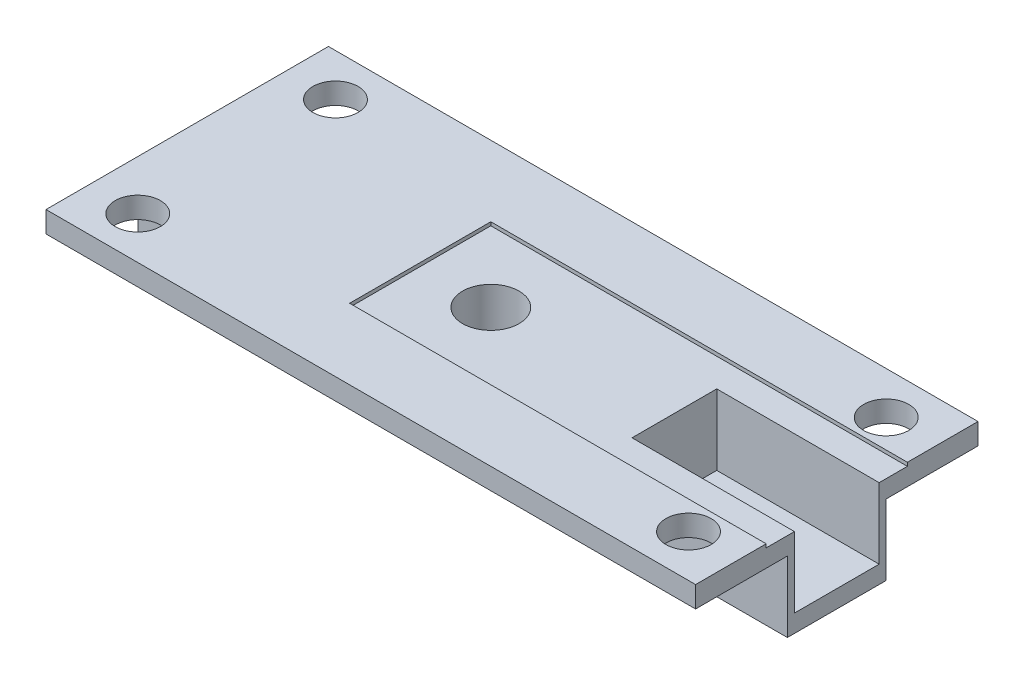
ISO-10303-21;
HEADER;
FILE_DESCRIPTION(('STEP AP214'),'2;1');
FILE_NAME('part.step','',(''),(''),'','','');
FILE_SCHEMA(('AUTOMOTIVE_DESIGN { 1 0 10303 214 1 1 1 1 }'));
ENDSEC;
DATA;
#1=APPLICATION_CONTEXT('core data for automotive mechanical design processes');
#2=APPLICATION_PROTOCOL_DEFINITION('international standard','automotive_design',2000,#1);
#3=PRODUCT_CONTEXT('',#1,'mechanical');
#4=PRODUCT('Part','Part','',(#3));
#5=PRODUCT_RELATED_PRODUCT_CATEGORY('part','',(#4));
#6=PRODUCT_DEFINITION_FORMATION('','',#4);
#7=PRODUCT_DEFINITION_CONTEXT('part definition',#1,'design');
#8=PRODUCT_DEFINITION('design','',#6,#7);
#9=PRODUCT_DEFINITION_SHAPE('','',#8);
#10=(LENGTH_UNIT() NAMED_UNIT(*) SI_UNIT(.MILLI.,.METRE.));
#11=(NAMED_UNIT(*) PLANE_ANGLE_UNIT() SI_UNIT($,.RADIAN.));
#12=(NAMED_UNIT(*) SI_UNIT($,.STERADIAN.) SOLID_ANGLE_UNIT());
#13=UNCERTAINTY_MEASURE_WITH_UNIT(LENGTH_MEASURE(1.E-05),#10,'distance_accuracy_value','');
#14=(GEOMETRIC_REPRESENTATION_CONTEXT(3) GLOBAL_UNCERTAINTY_ASSIGNED_CONTEXT((#13)) GLOBAL_UNIT_ASSIGNED_CONTEXT((#10,
#11,#12)) REPRESENTATION_CONTEXT('',''));
#15=CARTESIAN_POINT('',(0.,0.,0.));
#16=DIRECTION('',(0.,0.,1.));
#17=DIRECTION('',(1.,0.,0.));
#18=AXIS2_PLACEMENT_3D('',#15,#16,#17);
#19=CARTESIAN_POINT('',(0.,6.5,0.));
#20=DIRECTION('',(0.,1.,0.));
#21=DIRECTION('',(0.,0.,1.));
#22=AXIS2_PLACEMENT_3D('',#19,#20,#21);
#23=PLANE('',#22);
#24=DIRECTION('',(1.,0.,0.));
#25=VECTOR('',#24,1.);
#26=CARTESIAN_POINT('',(-6.5,6.5,5.));
#27=LINE('',#26,#25);
#28=CARTESIAN_POINT('',(-6.5,6.5,5.));
#29=VERTEX_POINT('',#28);
#30=CARTESIAN_POINT('',(23.,6.5,5.));
#31=VERTEX_POINT('',#30);
#32=EDGE_CURVE('E290',#29,#31,#27,.T.);
#33=ORIENTED_EDGE('',*,*,#32,.F.);
#34=DIRECTION('',(0.,0.,1.));
#35=VECTOR('',#34,1.);
#36=CARTESIAN_POINT('',(-6.5,6.5,-5.));
#37=LINE('',#36,#35);
#38=CARTESIAN_POINT('',(-6.5,6.5,-5.));
#39=VERTEX_POINT('',#38);
#40=EDGE_CURVE('E287',#39,#29,#37,.T.);
#41=ORIENTED_EDGE('',*,*,#40,.F.);
#42=DIRECTION('',(-1.,0.,0.));
#43=VECTOR('',#42,1.);
#44=CARTESIAN_POINT('',(-6.5,6.5,-5.));
#45=LINE('',#44,#43);
#46=CARTESIAN_POINT('',(23.,6.5,-5.));
#47=VERTEX_POINT('',#46);
#48=EDGE_CURVE('E269',#47,#39,#45,.T.);
#49=ORIENTED_EDGE('',*,*,#48,.F.);
#50=DIRECTION('',(0.,0.,-1.));
#51=VECTOR('',#50,1.);
#52=CARTESIAN_POINT('',(23.,6.5,-10.));
#53=LINE('',#52,#51);
#54=CARTESIAN_POINT('',(23.,6.5,-10.));
#55=VERTEX_POINT('',#54);
#56=EDGE_CURVE('E311',#47,#55,#53,.T.);
#57=ORIENTED_EDGE('',*,*,#56,.T.);
#58=DIRECTION('',(-1.,0.,0.));
#59=VECTOR('',#58,1.);
#60=CARTESIAN_POINT('',(-23.,6.5,-10.));
#61=LINE('',#60,#59);
#62=CARTESIAN_POINT('',(-23.,6.5,-10.));
#63=VERTEX_POINT('',#62);
#64=EDGE_CURVE('E187',#55,#63,#61,.T.);
#65=ORIENTED_EDGE('',*,*,#64,.T.);
#66=DIRECTION('',(0.,0.,1.));
#67=VECTOR('',#66,1.);
#68=CARTESIAN_POINT('',(-23.,6.5,-10.));
#69=LINE('',#68,#67);
#70=CARTESIAN_POINT('',(-23.,6.5,10.));
#71=VERTEX_POINT('',#70);
#72=EDGE_CURVE('E181',#63,#71,#69,.T.);
#73=ORIENTED_EDGE('',*,*,#72,.T.);
#74=DIRECTION('',(1.,0.,0.));
#75=VECTOR('',#74,1.);
#76=CARTESIAN_POINT('',(-23.,6.5,10.));
#77=LINE('',#76,#75);
#78=CARTESIAN_POINT('',(23.,6.5,10.));
#79=VERTEX_POINT('',#78);
#80=EDGE_CURVE('E310',#71,#79,#77,.T.);
#81=ORIENTED_EDGE('',*,*,#80,.T.);
#82=EDGE_CURVE('E312',#79,#31,#53,.T.);
#83=ORIENTED_EDGE('',*,*,#82,.T.);
#84=EDGE_LOOP('',(#33,#41,#49,#57,#65,#73,#81,#83));
#85=FACE_BOUND('',#84,.T.);
#86=CARTESIAN_POINT('',(-19.5,6.5,7.));
#87=DIRECTION('',(0.,1.,0.));
#88=DIRECTION('',(0.,0.,-1.));
#89=AXIS2_PLACEMENT_3D('',#86,#87,#88);
#90=CIRCLE('',#89,1.6);
#91=CARTESIAN_POINT('',(-19.5,6.5,5.4));
#92=VERTEX_POINT('',#91);
#93=EDGE_CURVE('E303',#92,#92,#90,.T.);
#94=ORIENTED_EDGE('',*,*,#93,.F.);
#95=EDGE_LOOP('',(#94));
#96=FACE_BOUND('',#95,.T.);
#97=CARTESIAN_POINT('',(-19.5,6.5,-7.));
#98=DIRECTION('',(0.,1.,0.));
#99=DIRECTION('',(0.,0.,1.));
#100=AXIS2_PLACEMENT_3D('',#97,#98,#99);
#101=CIRCLE('',#100,1.6);
#102=CARTESIAN_POINT('',(-19.5,6.5,-8.6));
#103=VERTEX_POINT('',#102);
#104=EDGE_CURVE('E179',#103,#103,#101,.T.);
#105=ORIENTED_EDGE('',*,*,#104,.F.);
#106=EDGE_LOOP('',(#105));
#107=FACE_BOUND('',#106,.T.);
#108=CARTESIAN_POINT('',(19.5,6.5,-7.));
#109=DIRECTION('',(0.,1.,0.));
#110=DIRECTION('',(0.,0.,-1.));
#111=AXIS2_PLACEMENT_3D('',#108,#109,#110);
#112=CIRCLE('',#111,1.6);
#113=CARTESIAN_POINT('',(19.5,6.5,-8.6));
#114=VERTEX_POINT('',#113);
#115=EDGE_CURVE('E184',#114,#114,#112,.T.);
#116=ORIENTED_EDGE('',*,*,#115,.F.);
#117=EDGE_LOOP('',(#116));
#118=FACE_BOUND('',#117,.T.);
#119=CARTESIAN_POINT('',(19.5,6.5,7.));
#120=DIRECTION('',(0.,1.,0.));
#121=DIRECTION('',(0.,0.,1.));
#122=AXIS2_PLACEMENT_3D('',#119,#120,#121);
#123=CIRCLE('',#122,1.6);
#124=CARTESIAN_POINT('',(19.5,6.5,5.4));
#125=VERTEX_POINT('',#124);
#126=EDGE_CURVE('E295',#125,#125,#123,.T.);
#127=ORIENTED_EDGE('',*,*,#126,.F.);
#128=EDGE_LOOP('',(#127));
#129=FACE_BOUND('',#128,.T.);
#130=ADVANCED_FACE('F43',(#85,#96,#107,#118,#129),#23,.T.);
#131=CARTESIAN_POINT('',(0.,0.,0.));
#132=DIRECTION('',(0.,1.,0.));
#133=DIRECTION('',(0.,0.,1.));
#134=AXIS2_PLACEMENT_3D('',#131,#132,#133);
#135=PLANE('',#134);
#136=CARTESIAN_POINT('',(-1.5,0.,0.));
#137=DIRECTION('',(0.,1.,0.));
#138=DIRECTION('',(0.,0.,1.));
#139=AXIS2_PLACEMENT_3D('',#136,#137,#138);
#140=CIRCLE('',#139,1.35);
#141=CARTESIAN_POINT('',(-1.5,0.,1.35));
#142=VERTEX_POINT('',#141);
#143=EDGE_CURVE('E198',#142,#142,#140,.T.);
#144=ORIENTED_EDGE('',*,*,#143,.T.);
#145=EDGE_LOOP('',(#144));
#146=FACE_BOUND('',#145,.T.);
#147=DIRECTION('',(0.,0.,-1.));
#148=VECTOR('',#147,1.);
#149=CARTESIAN_POINT('',(23.,0.,-10.));
#150=LINE('',#149,#148);
#151=CARTESIAN_POINT('',(23.,0.,3.5));
#152=VERTEX_POINT('',#151);
#153=CARTESIAN_POINT('',(23.,0.,-3.5));
#154=VERTEX_POINT('',#153);
#155=EDGE_CURVE('E174',#152,#154,#150,.T.);
#156=ORIENTED_EDGE('',*,*,#155,.F.);
#157=DIRECTION('',(1.,0.,0.));
#158=VECTOR('',#157,1.);
#159=CARTESIAN_POINT('',(-23.,0.,3.5));
#160=LINE('',#159,#158);
#161=CARTESIAN_POINT('',(-23.,0.,3.5));
#162=VERTEX_POINT('',#161);
#163=EDGE_CURVE('E60',#162,#152,#160,.T.);
#164=ORIENTED_EDGE('',*,*,#163,.F.);
#165=DIRECTION('',(0.,0.,1.));
#166=VECTOR('',#165,1.);
#167=CARTESIAN_POINT('',(-23.,0.,-10.));
#168=LINE('',#167,#166);
#169=CARTESIAN_POINT('',(-23.,0.,-3.5));
#170=VERTEX_POINT('',#169);
#171=EDGE_CURVE('E172',#170,#162,#168,.T.);
#172=ORIENTED_EDGE('',*,*,#171,.F.);
#173=DIRECTION('',(1.,0.,0.));
#174=VECTOR('',#173,1.);
#175=CARTESIAN_POINT('',(-23.,0.,-3.5));
#176=LINE('',#175,#174);
#177=EDGE_CURVE('E222',#170,#154,#176,.T.);
#178=ORIENTED_EDGE('',*,*,#177,.T.);
#179=EDGE_LOOP('',(#156,#164,#172,#178));
#180=FACE_BOUND('',#179,.T.);
#181=ADVANCED_FACE('F170',(#146,#180),#135,.F.);
#182=CARTESIAN_POINT('',(-23.,6.5,-10.));
#183=DIRECTION('',(1.,0.,0.));
#184=DIRECTION('',(0.,0.,-1.));
#185=AXIS2_PLACEMENT_3D('',#182,#183,#184);
#186=PLANE('',#185);
#187=DIRECTION('',(0.,1.,0.));
#188=VECTOR('',#187,1.);
#189=CARTESIAN_POINT('',(-23.,5.,3.5));
#190=LINE('',#189,#188);
#191=CARTESIAN_POINT('',(-23.,5.,3.5));
#192=VERTEX_POINT('',#191);
#193=EDGE_CURVE('E157',#162,#192,#190,.T.);
#194=ORIENTED_EDGE('',*,*,#193,.T.);
#195=DIRECTION('',(0.,0.,1.));
#196=VECTOR('',#195,1.);
#197=CARTESIAN_POINT('',(-23.,5.,10.));
#198=LINE('',#197,#196);
#199=CARTESIAN_POINT('',(-23.,5.,10.));
#200=VERTEX_POINT('',#199);
#201=EDGE_CURVE('E164',#192,#200,#198,.T.);
#202=ORIENTED_EDGE('',*,*,#201,.T.);
#203=DIRECTION('',(0.,-1.,0.));
#204=VECTOR('',#203,1.);
#205=CARTESIAN_POINT('',(-23.,6.5,10.));
#206=LINE('',#205,#204);
#207=EDGE_CURVE('E11',#71,#200,#206,.T.);
#208=ORIENTED_EDGE('',*,*,#207,.F.);
#209=ORIENTED_EDGE('',*,*,#72,.F.);
#210=DIRECTION('',(0.,-1.,0.));
#211=VECTOR('',#210,1.);
#212=CARTESIAN_POINT('',(-23.,6.5,-10.));
#213=LINE('',#212,#211);
#214=CARTESIAN_POINT('',(-23.,5.,-10.));
#215=VERTEX_POINT('',#214);
#216=EDGE_CURVE('E190',#63,#215,#213,.T.);
#217=ORIENTED_EDGE('',*,*,#216,.T.);
#218=DIRECTION('',(0.,0.,1.));
#219=VECTOR('',#218,1.);
#220=CARTESIAN_POINT('',(-23.,5.,-10.));
#221=LINE('',#220,#219);
#222=CARTESIAN_POINT('',(-23.,5.,-3.5));
#223=VERTEX_POINT('',#222);
#224=EDGE_CURVE('E68',#215,#223,#221,.T.);
#225=ORIENTED_EDGE('',*,*,#224,.T.);
#226=DIRECTION('',(0.,-1.,0.));
#227=VECTOR('',#226,1.);
#228=CARTESIAN_POINT('',(-23.,0.,-3.5));
#229=LINE('',#228,#227);
#230=EDGE_CURVE('E178',#223,#170,#229,.T.);
#231=ORIENTED_EDGE('',*,*,#230,.T.);
#232=ORIENTED_EDGE('',*,*,#171,.T.);
#233=EDGE_LOOP('',(#194,#202,#208,#209,#217,#225,#231,#232));
#234=FACE_BOUND('',#233,.T.);
#235=ADVANCED_FACE('F45',(#234),#186,.F.);
#236=CARTESIAN_POINT('',(-23.,6.5,10.));
#237=DIRECTION('',(0.,0.,-1.));
#238=DIRECTION('',(-1.,0.,0.));
#239=AXIS2_PLACEMENT_3D('',#236,#237,#238);
#240=PLANE('',#239);
#241=ORIENTED_EDGE('',*,*,#207,.T.);
#242=DIRECTION('',(1.,0.,0.));
#243=VECTOR('',#242,1.);
#244=CARTESIAN_POINT('',(-23.,5.,10.));
#245=LINE('',#244,#243);
#246=CARTESIAN_POINT('',(23.,5.,10.));
#247=VERTEX_POINT('',#246);
#248=EDGE_CURVE('E205',#200,#247,#245,.T.);
#249=ORIENTED_EDGE('',*,*,#248,.T.);
#250=DIRECTION('',(0.,-1.,0.));
#251=VECTOR('',#250,1.);
#252=CARTESIAN_POINT('',(23.,6.5,10.));
#253=LINE('',#252,#251);
#254=EDGE_CURVE('E52',#79,#247,#253,.T.);
#255=ORIENTED_EDGE('',*,*,#254,.F.);
#256=ORIENTED_EDGE('',*,*,#80,.F.);
#257=EDGE_LOOP('',(#241,#249,#255,#256));
#258=FACE_BOUND('',#257,.T.);
#259=ADVANCED_FACE('F333',(#258),#240,.F.);
#260=CARTESIAN_POINT('',(23.,6.5,-10.));
#261=DIRECTION('',(-1.,0.,0.));
#262=DIRECTION('',(0.,0.,1.));
#263=AXIS2_PLACEMENT_3D('',#260,#261,#262);
#264=PLANE('',#263);
#265=ORIENTED_EDGE('',*,*,#254,.T.);
#266=DIRECTION('',(0.,0.,1.));
#267=VECTOR('',#266,1.);
#268=CARTESIAN_POINT('',(23.,5.,10.));
#269=LINE('',#268,#267);
#270=CARTESIAN_POINT('',(23.,5.,3.5));
#271=VERTEX_POINT('',#270);
#272=EDGE_CURVE('E165',#271,#247,#269,.T.);
#273=ORIENTED_EDGE('',*,*,#272,.F.);
#274=DIRECTION('',(0.,1.,0.));
#275=VECTOR('',#274,1.);
#276=CARTESIAN_POINT('',(23.,5.,3.5));
#277=LINE('',#276,#275);
#278=EDGE_CURVE('E229',#152,#271,#277,.T.);
#279=ORIENTED_EDGE('',*,*,#278,.F.);
#280=ORIENTED_EDGE('',*,*,#155,.T.);
#281=DIRECTION('',(0.,-1.,0.));
#282=VECTOR('',#281,1.);
#283=CARTESIAN_POINT('',(23.,0.,-3.5));
#284=LINE('',#283,#282);
#285=CARTESIAN_POINT('',(23.,5.,-3.5));
#286=VERTEX_POINT('',#285);
#287=EDGE_CURVE('E224',#286,#154,#284,.T.);
#288=ORIENTED_EDGE('',*,*,#287,.F.);
#289=DIRECTION('',(0.,0.,1.));
#290=VECTOR('',#289,1.);
#291=CARTESIAN_POINT('',(23.,5.,-10.));
#292=LINE('',#291,#290);
#293=CARTESIAN_POINT('',(23.,5.,-10.));
#294=VERTEX_POINT('',#293);
#295=EDGE_CURVE('E226',#294,#286,#292,.T.);
#296=ORIENTED_EDGE('',*,*,#295,.F.);
#297=DIRECTION('',(0.,-1.,0.));
#298=VECTOR('',#297,1.);
#299=CARTESIAN_POINT('',(23.,6.5,-10.));
#300=LINE('',#299,#298);
#301=EDGE_CURVE('E193',#55,#294,#300,.T.);
#302=ORIENTED_EDGE('',*,*,#301,.F.);
#303=ORIENTED_EDGE('',*,*,#56,.F.);
#304=DIRECTION('',(0.,1.,0.));
#305=VECTOR('',#304,1.);
#306=CARTESIAN_POINT('',(23.,6.25,-5.));
#307=LINE('',#306,#305);
#308=CARTESIAN_POINT('',(23.,6.25,-5.));
#309=VERTEX_POINT('',#308);
#310=EDGE_CURVE('E284',#309,#47,#307,.T.);
#311=ORIENTED_EDGE('',*,*,#310,.F.);
#312=DIRECTION('',(0.,0.,-1.));
#313=VECTOR('',#312,1.);
#314=CARTESIAN_POINT('',(23.,6.25,-5.));
#315=LINE('',#314,#313);
#316=CARTESIAN_POINT('',(23.,6.25,-3.));
#317=VERTEX_POINT('',#316);
#318=EDGE_CURVE('E276',#317,#309,#315,.T.);
#319=ORIENTED_EDGE('',*,*,#318,.F.);
#320=DIRECTION('',(0.,1.,0.));
#321=VECTOR('',#320,1.);
#322=CARTESIAN_POINT('',(23.,1.25,-3.));
#323=LINE('',#322,#321);
#324=CARTESIAN_POINT('',(23.,1.25,-3.));
#325=VERTEX_POINT('',#324);
#326=EDGE_CURVE('E255',#325,#317,#323,.T.);
#327=ORIENTED_EDGE('',*,*,#326,.F.);
#328=DIRECTION('',(0.,0.,-1.));
#329=VECTOR('',#328,1.);
#330=CARTESIAN_POINT('',(23.,1.25,-3.));
#331=LINE('',#330,#329);
#332=CARTESIAN_POINT('',(23.,1.25,3.));
#333=VERTEX_POINT('',#332);
#334=EDGE_CURVE('E246',#333,#325,#331,.T.);
#335=ORIENTED_EDGE('',*,*,#334,.F.);
#336=DIRECTION('',(0.,1.,0.));
#337=VECTOR('',#336,1.);
#338=CARTESIAN_POINT('',(23.,1.25,3.));
#339=LINE('',#338,#337);
#340=CARTESIAN_POINT('',(23.,6.25,3.));
#341=VERTEX_POINT('',#340);
#342=EDGE_CURVE('E257',#333,#341,#339,.T.);
#343=ORIENTED_EDGE('',*,*,#342,.T.);
#344=CARTESIAN_POINT('',(23.,6.25,5.));
#345=VERTEX_POINT('',#344);
#346=EDGE_CURVE('E272',#345,#341,#315,.T.);
#347=ORIENTED_EDGE('',*,*,#346,.F.);
#348=DIRECTION('',(0.,1.,0.));
#349=VECTOR('',#348,1.);
#350=CARTESIAN_POINT('',(23.,6.25,5.));
#351=LINE('',#350,#349);
#352=EDGE_CURVE('E292',#345,#31,#351,.T.);
#353=ORIENTED_EDGE('',*,*,#352,.T.);
#354=ORIENTED_EDGE('',*,*,#82,.F.);
#355=EDGE_LOOP('',(#265,#273,#279,#280,#288,#296,#302,#303,#311,#319,#327,#335,#343,#347,#353,#354));
#356=FACE_BOUND('',#355,.T.);
#357=ADVANCED_FACE('F327',(#356),#264,.F.);
#358=CARTESIAN_POINT('',(-23.,6.5,-10.));
#359=DIRECTION('',(0.,0.,1.));
#360=DIRECTION('',(1.,0.,0.));
#361=AXIS2_PLACEMENT_3D('',#358,#359,#360);
#362=PLANE('',#361);
#363=ORIENTED_EDGE('',*,*,#301,.T.);
#364=DIRECTION('',(1.,0.,0.));
#365=VECTOR('',#364,1.);
#366=CARTESIAN_POINT('',(-23.,5.,-10.));
#367=LINE('',#366,#365);
#368=EDGE_CURVE('E218',#215,#294,#367,.T.);
#369=ORIENTED_EDGE('',*,*,#368,.F.);
#370=ORIENTED_EDGE('',*,*,#216,.F.);
#371=ORIENTED_EDGE('',*,*,#64,.F.);
#372=EDGE_LOOP('',(#363,#369,#370,#371));
#373=FACE_BOUND('',#372,.T.);
#374=ADVANCED_FACE('F330',(#373),#362,.F.);
#375=CARTESIAN_POINT('',(-19.5,6.5,-7.));
#376=DIRECTION('',(0.,-1.,0.));
#377=DIRECTION('',(0.,0.,-1.));
#378=AXIS2_PLACEMENT_3D('',#375,#376,#377);
#379=CYLINDRICAL_SURFACE('',#378,1.6);
#380=CARTESIAN_POINT('',(-19.5,5.,-7.));
#381=DIRECTION('',(0.,1.,0.));
#382=DIRECTION('',(0.,0.,1.));
#383=AXIS2_PLACEMENT_3D('',#380,#381,#382);
#384=CIRCLE('',#383,1.6);
#385=CARTESIAN_POINT('',(-19.5,5.,-8.6));
#386=VERTEX_POINT('',#385);
#387=EDGE_CURVE('E232',#386,#386,#384,.T.);
#388=CARTESIAN_POINT('',(-19.5,5.,-8.6));
#389=CARTESIAN_POINT('',(-19.5,5.015625,-8.6));
#390=CARTESIAN_POINT('',(-19.5,5.03125,-8.6));
#391=CARTESIAN_POINT('',(-19.5,5.0625,-8.6));
#392=CARTESIAN_POINT('',(-19.5,5.078125,-8.6));
#393=CARTESIAN_POINT('',(-19.5,5.109375,-8.6));
#394=CARTESIAN_POINT('',(-19.5,5.125,-8.6));
#395=CARTESIAN_POINT('',(-19.5,5.15625,-8.6));
#396=CARTESIAN_POINT('',(-19.5,5.171875,-8.6));
#397=CARTESIAN_POINT('',(-19.5,5.203125,-8.6));
#398=CARTESIAN_POINT('',(-19.5,5.21875,-8.6));
#399=CARTESIAN_POINT('',(-19.5,5.25,-8.6));
#400=CARTESIAN_POINT('',(-19.5,5.265625,-8.6));
#401=CARTESIAN_POINT('',(-19.5,5.296875,-8.6));
#402=CARTESIAN_POINT('',(-19.5,5.3125,-8.6));
#403=CARTESIAN_POINT('',(-19.5,5.34375,-8.6));
#404=CARTESIAN_POINT('',(-19.5,5.359375,-8.6));
#405=CARTESIAN_POINT('',(-19.5,5.390625,-8.6));
#406=CARTESIAN_POINT('',(-19.5,5.40625,-8.6));
#407=CARTESIAN_POINT('',(-19.5,5.4375,-8.6));
#408=CARTESIAN_POINT('',(-19.5,5.453125,-8.6));
#409=CARTESIAN_POINT('',(-19.5,5.484375,-8.6));
#410=CARTESIAN_POINT('',(-19.5,5.5,-8.6));
#411=CARTESIAN_POINT('',(-19.5,5.53125,-8.6));
#412=CARTESIAN_POINT('',(-19.5,5.546875,-8.6));
#413=CARTESIAN_POINT('',(-19.5,5.578125,-8.6));
#414=CARTESIAN_POINT('',(-19.5,5.59375,-8.6));
#415=CARTESIAN_POINT('',(-19.5,5.625,-8.6));
#416=CARTESIAN_POINT('',(-19.5,5.640625,-8.6));
#417=CARTESIAN_POINT('',(-19.5,5.671875,-8.6));
#418=CARTESIAN_POINT('',(-19.5,5.6875,-8.6));
#419=CARTESIAN_POINT('',(-19.5,5.71875,-8.6));
#420=CARTESIAN_POINT('',(-19.5,5.734375,-8.6));
#421=CARTESIAN_POINT('',(-19.5,5.765625,-8.6));
#422=CARTESIAN_POINT('',(-19.5,5.78125,-8.6));
#423=CARTESIAN_POINT('',(-19.5,5.8125,-8.6));
#424=CARTESIAN_POINT('',(-19.5,5.828125,-8.6));
#425=CARTESIAN_POINT('',(-19.5,5.859375,-8.6));
#426=CARTESIAN_POINT('',(-19.5,5.875,-8.6));
#427=CARTESIAN_POINT('',(-19.5,5.90625,-8.6));
#428=CARTESIAN_POINT('',(-19.5,5.921875,-8.6));
#429=CARTESIAN_POINT('',(-19.5,5.953125,-8.6));
#430=CARTESIAN_POINT('',(-19.5,5.96875,-8.6));
#431=CARTESIAN_POINT('',(-19.5,6.,-8.6));
#432=CARTESIAN_POINT('',(-19.5,6.015625,-8.6));
#433=CARTESIAN_POINT('',(-19.5,6.046875,-8.6));
#434=CARTESIAN_POINT('',(-19.5,6.0625,-8.6));
#435=CARTESIAN_POINT('',(-19.5,6.09375,-8.6));
#436=CARTESIAN_POINT('',(-19.5,6.109375,-8.6));
#437=CARTESIAN_POINT('',(-19.5,6.140625,-8.6));
#438=CARTESIAN_POINT('',(-19.5,6.15625,-8.6));
#439=CARTESIAN_POINT('',(-19.5,6.1875,-8.6));
#440=CARTESIAN_POINT('',(-19.5,6.203125,-8.6));
#441=CARTESIAN_POINT('',(-19.5,6.234375,-8.6));
#442=CARTESIAN_POINT('',(-19.5,6.25,-8.6));
#443=CARTESIAN_POINT('',(-19.5,6.28125,-8.6));
#444=CARTESIAN_POINT('',(-19.5,6.296875,-8.6));
#445=CARTESIAN_POINT('',(-19.5,6.328125,-8.6));
#446=CARTESIAN_POINT('',(-19.5,6.34375,-8.6));
#447=CARTESIAN_POINT('',(-19.5,6.375,-8.6));
#448=CARTESIAN_POINT('',(-19.5,6.390625,-8.6));
#449=CARTESIAN_POINT('',(-19.5,6.421875,-8.6));
#450=CARTESIAN_POINT('',(-19.5,6.4375,-8.6));
#451=CARTESIAN_POINT('',(-19.5,6.46875,-8.6));
#452=CARTESIAN_POINT('',(-19.5,6.484375,-8.6));
#453=CARTESIAN_POINT('',(-19.5,6.5,-8.6));
#454=B_SPLINE_CURVE_WITH_KNOTS('',3,(#388,#389,#390,#391,#392,#393,#394,#395,#396,#397,#398,
#399,#400,#401,#402,#403,#404,#405,#406,#407,#408,#409,#410,#411,#412,#413,#414,#415,#416,#417,
#418,#419,#420,#421,#422,#423,#424,#425,#426,#427,#428,#429,#430,#431,#432,#433,#434,#435,#436,
#437,#438,#439,#440,#441,#442,#443,#444,#445,#446,#447,#448,#449,#450,#451,#452,#453),
.UNSPECIFIED.,.F.,.F.,(4,2,2,2,2,2,2,2,2,2,2,2,2,2,2,2,2,2,2,2,2,2,2,2,2,2,2,2,2,2,2,2,4),(0.,
0.046875,0.0937500000000001,0.140624999999999,0.187499999999999,0.234374999999999,
0.281249999999999,0.328124999999999,0.374999999999999,0.421875,0.46875,0.515625,0.5625,0.609375,
0.65625,0.703125,0.75,0.796875,0.84375,0.890624999999999,0.937499999999999,0.984374999999999,
1.03125,1.078125,1.125,1.171875,1.21875,1.265625,1.3125,1.359375,1.40625,1.453125,1.5),.UNSPECIFIED.);
#455=EDGE_CURVE('BSEAM383',#386,#103,#454,.T.);
#456=ORIENTED_EDGE('',*,*,#387,.F.);
#457=ORIENTED_EDGE('',*,*,#104,.T.);
#458=ORIENTED_EDGE('',*,*,#455,.T.);
#459=ORIENTED_EDGE('',*,*,#455,.F.);
#460=EDGE_LOOP('',(#456,#458,#457,#459));
#461=FACE_BOUND('',#460,.T.);
#462=ADVANCED_FACE('F383',(#461),#379,.F.);
#463=CARTESIAN_POINT('',(19.5,6.5,-7.));
#464=DIRECTION('',(0.,-1.,0.));
#465=DIRECTION('',(0.,0.,-1.));
#466=AXIS2_PLACEMENT_3D('',#463,#464,#465);
#467=CYLINDRICAL_SURFACE('',#466,1.6);
#468=CARTESIAN_POINT('',(19.5,5.,-7.));
#469=DIRECTION('',(0.,1.,0.));
#470=DIRECTION('',(0.,0.,1.));
#471=AXIS2_PLACEMENT_3D('',#468,#469,#470);
#472=CIRCLE('',#471,1.6);
#473=CARTESIAN_POINT('',(19.5,5.,-8.6));
#474=VERTEX_POINT('',#473);
#475=EDGE_CURVE('E47',#474,#474,#472,.T.);
#476=CARTESIAN_POINT('',(19.5,5.,-8.6));
#477=CARTESIAN_POINT('',(19.5,5.015625,-8.6));
#478=CARTESIAN_POINT('',(19.5,5.03125,-8.6));
#479=CARTESIAN_POINT('',(19.5,5.0625,-8.6));
#480=CARTESIAN_POINT('',(19.5,5.078125,-8.6));
#481=CARTESIAN_POINT('',(19.5,5.109375,-8.6));
#482=CARTESIAN_POINT('',(19.5,5.125,-8.6));
#483=CARTESIAN_POINT('',(19.5,5.15625,-8.6));
#484=CARTESIAN_POINT('',(19.5,5.171875,-8.6));
#485=CARTESIAN_POINT('',(19.5,5.203125,-8.6));
#486=CARTESIAN_POINT('',(19.5,5.21875,-8.6));
#487=CARTESIAN_POINT('',(19.5,5.25,-8.6));
#488=CARTESIAN_POINT('',(19.5,5.265625,-8.6));
#489=CARTESIAN_POINT('',(19.5,5.296875,-8.6));
#490=CARTESIAN_POINT('',(19.5,5.3125,-8.6));
#491=CARTESIAN_POINT('',(19.5,5.34375,-8.6));
#492=CARTESIAN_POINT('',(19.5,5.359375,-8.6));
#493=CARTESIAN_POINT('',(19.5,5.390625,-8.6));
#494=CARTESIAN_POINT('',(19.5,5.40625,-8.6));
#495=CARTESIAN_POINT('',(19.5,5.4375,-8.6));
#496=CARTESIAN_POINT('',(19.5,5.453125,-8.6));
#497=CARTESIAN_POINT('',(19.5,5.484375,-8.6));
#498=CARTESIAN_POINT('',(19.5,5.5,-8.6));
#499=CARTESIAN_POINT('',(19.5,5.53125,-8.6));
#500=CARTESIAN_POINT('',(19.5,5.546875,-8.6));
#501=CARTESIAN_POINT('',(19.5,5.578125,-8.6));
#502=CARTESIAN_POINT('',(19.5,5.59375,-8.6));
#503=CARTESIAN_POINT('',(19.5,5.625,-8.6));
#504=CARTESIAN_POINT('',(19.5,5.640625,-8.6));
#505=CARTESIAN_POINT('',(19.5,5.671875,-8.6));
#506=CARTESIAN_POINT('',(19.5,5.6875,-8.6));
#507=CARTESIAN_POINT('',(19.5,5.71875,-8.6));
#508=CARTESIAN_POINT('',(19.5,5.734375,-8.6));
#509=CARTESIAN_POINT('',(19.5,5.765625,-8.6));
#510=CARTESIAN_POINT('',(19.5,5.78125,-8.6));
#511=CARTESIAN_POINT('',(19.5,5.8125,-8.6));
#512=CARTESIAN_POINT('',(19.5,5.828125,-8.6));
#513=CARTESIAN_POINT('',(19.5,5.859375,-8.6));
#514=CARTESIAN_POINT('',(19.5,5.875,-8.6));
#515=CARTESIAN_POINT('',(19.5,5.90625,-8.6));
#516=CARTESIAN_POINT('',(19.5,5.921875,-8.6));
#517=CARTESIAN_POINT('',(19.5,5.953125,-8.6));
#518=CARTESIAN_POINT('',(19.5,5.96875,-8.6));
#519=CARTESIAN_POINT('',(19.5,6.,-8.6));
#520=CARTESIAN_POINT('',(19.5,6.015625,-8.6));
#521=CARTESIAN_POINT('',(19.5,6.046875,-8.6));
#522=CARTESIAN_POINT('',(19.5,6.0625,-8.6));
#523=CARTESIAN_POINT('',(19.5,6.09375,-8.6));
#524=CARTESIAN_POINT('',(19.5,6.109375,-8.6));
#525=CARTESIAN_POINT('',(19.5,6.140625,-8.6));
#526=CARTESIAN_POINT('',(19.5,6.15625,-8.6));
#527=CARTESIAN_POINT('',(19.5,6.1875,-8.6));
#528=CARTESIAN_POINT('',(19.5,6.203125,-8.6));
#529=CARTESIAN_POINT('',(19.5,6.234375,-8.6));
#530=CARTESIAN_POINT('',(19.5,6.25,-8.6));
#531=CARTESIAN_POINT('',(19.5,6.28125,-8.6));
#532=CARTESIAN_POINT('',(19.5,6.296875,-8.6));
#533=CARTESIAN_POINT('',(19.5,6.328125,-8.6));
#534=CARTESIAN_POINT('',(19.5,6.34375,-8.6));
#535=CARTESIAN_POINT('',(19.5,6.375,-8.6));
#536=CARTESIAN_POINT('',(19.5,6.390625,-8.6));
#537=CARTESIAN_POINT('',(19.5,6.421875,-8.6));
#538=CARTESIAN_POINT('',(19.5,6.4375,-8.6));
#539=CARTESIAN_POINT('',(19.5,6.46875,-8.6));
#540=CARTESIAN_POINT('',(19.5,6.484375,-8.6));
#541=CARTESIAN_POINT('',(19.5,6.5,-8.6));
#542=B_SPLINE_CURVE_WITH_KNOTS('',3,(#476,#477,#478,#479,#480,#481,#482,#483,#484,#485,#486,
#487,#488,#489,#490,#491,#492,#493,#494,#495,#496,#497,#498,#499,#500,#501,#502,#503,#504,#505,
#506,#507,#508,#509,#510,#511,#512,#513,#514,#515,#516,#517,#518,#519,#520,#521,#522,#523,#524,
#525,#526,#527,#528,#529,#530,#531,#532,#533,#534,#535,#536,#537,#538,#539,#540,#541),
.UNSPECIFIED.,.F.,.F.,(4,2,2,2,2,2,2,2,2,2,2,2,2,2,2,2,2,2,2,2,2,2,2,2,2,2,2,2,2,2,2,2,4),(0.,
0.046875,0.0937500000000001,0.140624999999999,0.187499999999999,0.234374999999999,
0.281249999999999,0.328124999999999,0.374999999999999,0.421875,0.46875,0.515625,0.5625,0.609375,
0.65625,0.703125,0.75,0.796875,0.84375,0.890624999999999,0.937499999999999,0.984374999999999,
1.03125,1.078125,1.125,1.171875,1.21875,1.265625,1.3125,1.359375,1.40625,1.453125,1.5),.UNSPECIFIED.);
#543=EDGE_CURVE('BSEAM538',#474,#114,#542,.T.);
#544=ORIENTED_EDGE('',*,*,#475,.F.);
#545=ORIENTED_EDGE('',*,*,#115,.T.);
#546=ORIENTED_EDGE('',*,*,#543,.T.);
#547=ORIENTED_EDGE('',*,*,#543,.F.);
#548=EDGE_LOOP('',(#544,#546,#545,#547));
#549=FACE_BOUND('',#548,.T.);
#550=ADVANCED_FACE('F538',(#549),#467,.F.);
#551=CARTESIAN_POINT('',(-19.5,6.5,7.));
#552=DIRECTION('',(0.,-1.,0.));
#553=DIRECTION('',(0.,0.,-1.));
#554=AXIS2_PLACEMENT_3D('',#551,#552,#553);
#555=CYLINDRICAL_SURFACE('',#554,1.6);
#556=CARTESIAN_POINT('',(-19.5,5.,7.));
#557=DIRECTION('',(0.,1.,0.));
#558=DIRECTION('',(0.,0.,1.));
#559=AXIS2_PLACEMENT_3D('',#556,#557,#558);
#560=CIRCLE('',#559,1.6);
#561=CARTESIAN_POINT('',(-19.5,5.,5.4));
#562=VERTEX_POINT('',#561);
#563=EDGE_CURVE('E204',#562,#562,#560,.T.);
#564=CARTESIAN_POINT('',(-19.5,5.,5.4));
#565=CARTESIAN_POINT('',(-19.5,5.015625,5.4));
#566=CARTESIAN_POINT('',(-19.5,5.03125,5.4));
#567=CARTESIAN_POINT('',(-19.5,5.0625,5.4));
#568=CARTESIAN_POINT('',(-19.5,5.078125,5.4));
#569=CARTESIAN_POINT('',(-19.5,5.109375,5.4));
#570=CARTESIAN_POINT('',(-19.5,5.125,5.4));
#571=CARTESIAN_POINT('',(-19.5,5.15625,5.4));
#572=CARTESIAN_POINT('',(-19.5,5.171875,5.4));
#573=CARTESIAN_POINT('',(-19.5,5.203125,5.4));
#574=CARTESIAN_POINT('',(-19.5,5.21875,5.4));
#575=CARTESIAN_POINT('',(-19.5,5.25,5.4));
#576=CARTESIAN_POINT('',(-19.5,5.265625,5.4));
#577=CARTESIAN_POINT('',(-19.5,5.296875,5.4));
#578=CARTESIAN_POINT('',(-19.5,5.3125,5.4));
#579=CARTESIAN_POINT('',(-19.5,5.34375,5.4));
#580=CARTESIAN_POINT('',(-19.5,5.359375,5.4));
#581=CARTESIAN_POINT('',(-19.5,5.390625,5.4));
#582=CARTESIAN_POINT('',(-19.5,5.40625,5.4));
#583=CARTESIAN_POINT('',(-19.5,5.4375,5.4));
#584=CARTESIAN_POINT('',(-19.5,5.453125,5.4));
#585=CARTESIAN_POINT('',(-19.5,5.484375,5.4));
#586=CARTESIAN_POINT('',(-19.5,5.5,5.4));
#587=CARTESIAN_POINT('',(-19.5,5.53125,5.4));
#588=CARTESIAN_POINT('',(-19.5,5.546875,5.4));
#589=CARTESIAN_POINT('',(-19.5,5.578125,5.4));
#590=CARTESIAN_POINT('',(-19.5,5.59375,5.4));
#591=CARTESIAN_POINT('',(-19.5,5.625,5.4));
#592=CARTESIAN_POINT('',(-19.5,5.640625,5.4));
#593=CARTESIAN_POINT('',(-19.5,5.671875,5.4));
#594=CARTESIAN_POINT('',(-19.5,5.6875,5.4));
#595=CARTESIAN_POINT('',(-19.5,5.71875,5.4));
#596=CARTESIAN_POINT('',(-19.5,5.734375,5.4));
#597=CARTESIAN_POINT('',(-19.5,5.765625,5.4));
#598=CARTESIAN_POINT('',(-19.5,5.78125,5.4));
#599=CARTESIAN_POINT('',(-19.5,5.8125,5.4));
#600=CARTESIAN_POINT('',(-19.5,5.828125,5.4));
#601=CARTESIAN_POINT('',(-19.5,5.859375,5.4));
#602=CARTESIAN_POINT('',(-19.5,5.875,5.4));
#603=CARTESIAN_POINT('',(-19.5,5.90625,5.4));
#604=CARTESIAN_POINT('',(-19.5,5.921875,5.4));
#605=CARTESIAN_POINT('',(-19.5,5.953125,5.4));
#606=CARTESIAN_POINT('',(-19.5,5.96875,5.4));
#607=CARTESIAN_POINT('',(-19.5,6.,5.4));
#608=CARTESIAN_POINT('',(-19.5,6.015625,5.4));
#609=CARTESIAN_POINT('',(-19.5,6.046875,5.4));
#610=CARTESIAN_POINT('',(-19.5,6.0625,5.4));
#611=CARTESIAN_POINT('',(-19.5,6.09375,5.4));
#612=CARTESIAN_POINT('',(-19.5,6.109375,5.4));
#613=CARTESIAN_POINT('',(-19.5,6.140625,5.4));
#614=CARTESIAN_POINT('',(-19.5,6.15625,5.4));
#615=CARTESIAN_POINT('',(-19.5,6.1875,5.4));
#616=CARTESIAN_POINT('',(-19.5,6.203125,5.4));
#617=CARTESIAN_POINT('',(-19.5,6.234375,5.4));
#618=CARTESIAN_POINT('',(-19.5,6.25,5.4));
#619=CARTESIAN_POINT('',(-19.5,6.28125,5.4));
#620=CARTESIAN_POINT('',(-19.5,6.296875,5.4));
#621=CARTESIAN_POINT('',(-19.5,6.328125,5.4));
#622=CARTESIAN_POINT('',(-19.5,6.34375,5.4));
#623=CARTESIAN_POINT('',(-19.5,6.375,5.4));
#624=CARTESIAN_POINT('',(-19.5,6.390625,5.4));
#625=CARTESIAN_POINT('',(-19.5,6.421875,5.4));
#626=CARTESIAN_POINT('',(-19.5,6.4375,5.4));
#627=CARTESIAN_POINT('',(-19.5,6.46875,5.4));
#628=CARTESIAN_POINT('',(-19.5,6.484375,5.4));
#629=CARTESIAN_POINT('',(-19.5,6.5,5.4));
#630=B_SPLINE_CURVE_WITH_KNOTS('',3,(#564,#565,#566,#567,#568,#569,#570,#571,#572,#573,#574,
#575,#576,#577,#578,#579,#580,#581,#582,#583,#584,#585,#586,#587,#588,#589,#590,#591,#592,#593,
#594,#595,#596,#597,#598,#599,#600,#601,#602,#603,#604,#605,#606,#607,#608,#609,#610,#611,#612,
#613,#614,#615,#616,#617,#618,#619,#620,#621,#622,#623,#624,#625,#626,#627,#628,#629),
.UNSPECIFIED.,.F.,.F.,(4,2,2,2,2,2,2,2,2,2,2,2,2,2,2,2,2,2,2,2,2,2,2,2,2,2,2,2,2,2,2,2,4),(0.,
0.046875,0.0937500000000001,0.140624999999999,0.187499999999999,0.234374999999999,
0.281249999999999,0.328124999999999,0.374999999999999,0.421875,0.46875,0.515625,0.5625,0.609375,
0.65625,0.703125,0.75,0.796875,0.84375,0.890624999999999,0.937499999999999,0.984374999999999,
1.03125,1.078125,1.125,1.171875,1.21875,1.265625,1.3125,1.359375,1.40625,1.453125,1.5),.UNSPECIFIED.);
#631=EDGE_CURVE('BSEAM547',#562,#92,#630,.T.);
#632=ORIENTED_EDGE('',*,*,#563,.F.);
#633=ORIENTED_EDGE('',*,*,#93,.T.);
#634=ORIENTED_EDGE('',*,*,#631,.T.);
#635=ORIENTED_EDGE('',*,*,#631,.F.);
#636=EDGE_LOOP('',(#632,#634,#633,#635));
#637=FACE_BOUND('',#636,.T.);
#638=ADVANCED_FACE('F547',(#637),#555,.F.);
#639=CARTESIAN_POINT('',(19.5,6.5,7.));
#640=DIRECTION('',(0.,-1.,0.));
#641=DIRECTION('',(0.,0.,-1.));
#642=AXIS2_PLACEMENT_3D('',#639,#640,#641);
#643=CYLINDRICAL_SURFACE('',#642,1.6);
#644=CARTESIAN_POINT('',(19.5,5.,7.));
#645=DIRECTION('',(0.,1.,0.));
#646=DIRECTION('',(0.,0.,1.));
#647=AXIS2_PLACEMENT_3D('',#644,#645,#646);
#648=CIRCLE('',#647,1.6);
#649=CARTESIAN_POINT('',(19.5,5.,5.4));
#650=VERTEX_POINT('',#649);
#651=EDGE_CURVE('E202',#650,#650,#648,.T.);
#652=CARTESIAN_POINT('',(19.5,5.,5.4));
#653=CARTESIAN_POINT('',(19.5,5.015625,5.4));
#654=CARTESIAN_POINT('',(19.5,5.03125,5.4));
#655=CARTESIAN_POINT('',(19.5,5.0625,5.4));
#656=CARTESIAN_POINT('',(19.5,5.078125,5.4));
#657=CARTESIAN_POINT('',(19.5,5.109375,5.4));
#658=CARTESIAN_POINT('',(19.5,5.125,5.4));
#659=CARTESIAN_POINT('',(19.5,5.15625,5.4));
#660=CARTESIAN_POINT('',(19.5,5.171875,5.4));
#661=CARTESIAN_POINT('',(19.5,5.203125,5.4));
#662=CARTESIAN_POINT('',(19.5,5.21875,5.4));
#663=CARTESIAN_POINT('',(19.5,5.25,5.4));
#664=CARTESIAN_POINT('',(19.5,5.265625,5.4));
#665=CARTESIAN_POINT('',(19.5,5.296875,5.4));
#666=CARTESIAN_POINT('',(19.5,5.3125,5.4));
#667=CARTESIAN_POINT('',(19.5,5.34375,5.4));
#668=CARTESIAN_POINT('',(19.5,5.359375,5.4));
#669=CARTESIAN_POINT('',(19.5,5.390625,5.4));
#670=CARTESIAN_POINT('',(19.5,5.40625,5.4));
#671=CARTESIAN_POINT('',(19.5,5.4375,5.4));
#672=CARTESIAN_POINT('',(19.5,5.453125,5.4));
#673=CARTESIAN_POINT('',(19.5,5.484375,5.4));
#674=CARTESIAN_POINT('',(19.5,5.5,5.4));
#675=CARTESIAN_POINT('',(19.5,5.53125,5.4));
#676=CARTESIAN_POINT('',(19.5,5.546875,5.4));
#677=CARTESIAN_POINT('',(19.5,5.578125,5.4));
#678=CARTESIAN_POINT('',(19.5,5.59375,5.4));
#679=CARTESIAN_POINT('',(19.5,5.625,5.4));
#680=CARTESIAN_POINT('',(19.5,5.640625,5.4));
#681=CARTESIAN_POINT('',(19.5,5.671875,5.4));
#682=CARTESIAN_POINT('',(19.5,5.6875,5.4));
#683=CARTESIAN_POINT('',(19.5,5.71875,5.4));
#684=CARTESIAN_POINT('',(19.5,5.734375,5.4));
#685=CARTESIAN_POINT('',(19.5,5.765625,5.4));
#686=CARTESIAN_POINT('',(19.5,5.78125,5.4));
#687=CARTESIAN_POINT('',(19.5,5.8125,5.4));
#688=CARTESIAN_POINT('',(19.5,5.828125,5.4));
#689=CARTESIAN_POINT('',(19.5,5.859375,5.4));
#690=CARTESIAN_POINT('',(19.5,5.875,5.4));
#691=CARTESIAN_POINT('',(19.5,5.90625,5.4));
#692=CARTESIAN_POINT('',(19.5,5.921875,5.4));
#693=CARTESIAN_POINT('',(19.5,5.953125,5.4));
#694=CARTESIAN_POINT('',(19.5,5.96875,5.4));
#695=CARTESIAN_POINT('',(19.5,6.,5.4));
#696=CARTESIAN_POINT('',(19.5,6.015625,5.4));
#697=CARTESIAN_POINT('',(19.5,6.046875,5.4));
#698=CARTESIAN_POINT('',(19.5,6.0625,5.4));
#699=CARTESIAN_POINT('',(19.5,6.09375,5.4));
#700=CARTESIAN_POINT('',(19.5,6.109375,5.4));
#701=CARTESIAN_POINT('',(19.5,6.140625,5.4));
#702=CARTESIAN_POINT('',(19.5,6.15625,5.4));
#703=CARTESIAN_POINT('',(19.5,6.1875,5.4));
#704=CARTESIAN_POINT('',(19.5,6.203125,5.4));
#705=CARTESIAN_POINT('',(19.5,6.234375,5.4));
#706=CARTESIAN_POINT('',(19.5,6.25,5.4));
#707=CARTESIAN_POINT('',(19.5,6.28125,5.4));
#708=CARTESIAN_POINT('',(19.5,6.296875,5.4));
#709=CARTESIAN_POINT('',(19.5,6.328125,5.4));
#710=CARTESIAN_POINT('',(19.5,6.34375,5.4));
#711=CARTESIAN_POINT('',(19.5,6.375,5.4));
#712=CARTESIAN_POINT('',(19.5,6.390625,5.4));
#713=CARTESIAN_POINT('',(19.5,6.421875,5.4));
#714=CARTESIAN_POINT('',(19.5,6.4375,5.4));
#715=CARTESIAN_POINT('',(19.5,6.46875,5.4));
#716=CARTESIAN_POINT('',(19.5,6.484375,5.4));
#717=CARTESIAN_POINT('',(19.5,6.5,5.4));
#718=B_SPLINE_CURVE_WITH_KNOTS('',3,(#652,#653,#654,#655,#656,#657,#658,#659,#660,#661,#662,
#663,#664,#665,#666,#667,#668,#669,#670,#671,#672,#673,#674,#675,#676,#677,#678,#679,#680,#681,
#682,#683,#684,#685,#686,#687,#688,#689,#690,#691,#692,#693,#694,#695,#696,#697,#698,#699,#700,
#701,#702,#703,#704,#705,#706,#707,#708,#709,#710,#711,#712,#713,#714,#715,#716,#717),
.UNSPECIFIED.,.F.,.F.,(4,2,2,2,2,2,2,2,2,2,2,2,2,2,2,2,2,2,2,2,2,2,2,2,2,2,2,2,2,2,2,2,4),(0.,
0.046875,0.0937500000000001,0.140624999999999,0.187499999999999,0.234374999999999,
0.281249999999999,0.328124999999999,0.374999999999999,0.421875,0.46875,0.515625,0.5625,0.609375,
0.65625,0.703125,0.75,0.796875,0.84375,0.890624999999999,0.937499999999999,0.984374999999999,
1.03125,1.078125,1.125,1.171875,1.21875,1.265625,1.3125,1.359375,1.40625,1.453125,1.5),.UNSPECIFIED.);
#719=EDGE_CURVE('BSEAM498',#650,#125,#718,.T.);
#720=ORIENTED_EDGE('',*,*,#651,.F.);
#721=ORIENTED_EDGE('',*,*,#126,.T.);
#722=ORIENTED_EDGE('',*,*,#719,.T.);
#723=ORIENTED_EDGE('',*,*,#719,.F.);
#724=EDGE_LOOP('',(#720,#722,#721,#723));
#725=FACE_BOUND('',#724,.T.);
#726=ADVANCED_FACE('F498',(#725),#643,.F.);
#727=CARTESIAN_POINT('',(-6.5,6.25,5.));
#728=DIRECTION('',(0.,0.,1.));
#729=DIRECTION('',(1.,0.,0.));
#730=AXIS2_PLACEMENT_3D('',#727,#728,#729);
#731=PLANE('',#730);
#732=ORIENTED_EDGE('',*,*,#32,.T.);
#733=ORIENTED_EDGE('',*,*,#352,.F.);
#734=DIRECTION('',(1.,0.,0.));
#735=VECTOR('',#734,1.);
#736=CARTESIAN_POINT('',(-6.5,6.25,5.));
#737=LINE('',#736,#735);
#738=CARTESIAN_POINT('',(-6.5,6.25,5.));
#739=VERTEX_POINT('',#738);
#740=EDGE_CURVE('E282',#739,#345,#737,.T.);
#741=ORIENTED_EDGE('',*,*,#740,.F.);
#742=DIRECTION('',(0.,1.,0.));
#743=VECTOR('',#742,1.);
#744=CARTESIAN_POINT('',(-6.5,6.25,5.));
#745=LINE('',#744,#743);
#746=EDGE_CURVE('E296',#739,#29,#745,.T.);
#747=ORIENTED_EDGE('',*,*,#746,.T.);
#748=EDGE_LOOP('',(#732,#733,#741,#747));
#749=FACE_BOUND('',#748,.T.);
#750=ADVANCED_FACE('F339',(#749),#731,.F.);
#751=CARTESIAN_POINT('',(-6.5,6.25,-5.));
#752=DIRECTION('',(-1.,0.,0.));
#753=DIRECTION('',(0.,0.,1.));
#754=AXIS2_PLACEMENT_3D('',#751,#752,#753);
#755=PLANE('',#754);
#756=ORIENTED_EDGE('',*,*,#40,.T.);
#757=ORIENTED_EDGE('',*,*,#746,.F.);
#758=DIRECTION('',(0.,0.,1.));
#759=VECTOR('',#758,1.);
#760=CARTESIAN_POINT('',(-6.5,6.25,-5.));
#761=LINE('',#760,#759);
#762=CARTESIAN_POINT('',(-6.5,6.25,-5.));
#763=VERTEX_POINT('',#762);
#764=EDGE_CURVE('E279',#763,#739,#761,.T.);
#765=ORIENTED_EDGE('',*,*,#764,.F.);
#766=DIRECTION('',(0.,1.,0.));
#767=VECTOR('',#766,1.);
#768=CARTESIAN_POINT('',(-6.5,6.25,-5.));
#769=LINE('',#768,#767);
#770=EDGE_CURVE('E298',#763,#39,#769,.T.);
#771=ORIENTED_EDGE('',*,*,#770,.T.);
#772=EDGE_LOOP('',(#756,#757,#765,#771));
#773=FACE_BOUND('',#772,.T.);
#774=ADVANCED_FACE('F341',(#773),#755,.F.);
#775=CARTESIAN_POINT('',(-6.5,6.25,-5.));
#776=DIRECTION('',(0.,0.,-1.));
#777=DIRECTION('',(-1.,0.,0.));
#778=AXIS2_PLACEMENT_3D('',#775,#776,#777);
#779=PLANE('',#778);
#780=ORIENTED_EDGE('',*,*,#48,.T.);
#781=ORIENTED_EDGE('',*,*,#770,.F.);
#782=DIRECTION('',(-1.,0.,0.));
#783=VECTOR('',#782,1.);
#784=CARTESIAN_POINT('',(-6.5,6.25,-5.));
#785=LINE('',#784,#783);
#786=EDGE_CURVE('E275',#309,#763,#785,.T.);
#787=ORIENTED_EDGE('',*,*,#786,.F.);
#788=ORIENTED_EDGE('',*,*,#310,.T.);
#789=EDGE_LOOP('',(#780,#781,#787,#788));
#790=FACE_BOUND('',#789,.T.);
#791=ADVANCED_FACE('F345',(#790),#779,.F.);
#792=CARTESIAN_POINT('',(0.,6.25,0.));
#793=DIRECTION('',(0.,1.,0.));
#794=DIRECTION('',(0.,0.,1.));
#795=AXIS2_PLACEMENT_3D('',#792,#793,#794);
#796=PLANE('',#795);
#797=DIRECTION('',(-1.,0.,0.));
#798=VECTOR('',#797,1.);
#799=CARTESIAN_POINT('',(11.5,6.25,-3.));
#800=LINE('',#799,#798);
#801=CARTESIAN_POINT('',(11.5,6.25,-3.));
#802=VERTEX_POINT('',#801);
#803=EDGE_CURVE('E235',#317,#802,#800,.T.);
#804=ORIENTED_EDGE('',*,*,#803,.F.);
#805=ORIENTED_EDGE('',*,*,#318,.T.);
#806=ORIENTED_EDGE('',*,*,#786,.T.);
#807=ORIENTED_EDGE('',*,*,#764,.T.);
#808=ORIENTED_EDGE('',*,*,#740,.T.);
#809=ORIENTED_EDGE('',*,*,#346,.T.);
#810=DIRECTION('',(1.,0.,0.));
#811=VECTOR('',#810,1.);
#812=CARTESIAN_POINT('',(11.5,6.25,3.));
#813=LINE('',#812,#811);
#814=CARTESIAN_POINT('',(11.5,6.25,3.));
#815=VERTEX_POINT('',#814);
#816=EDGE_CURVE('E240',#815,#341,#813,.T.);
#817=ORIENTED_EDGE('',*,*,#816,.F.);
#818=DIRECTION('',(0.,0.,1.));
#819=VECTOR('',#818,1.);
#820=CARTESIAN_POINT('',(11.5,6.25,-3.));
#821=LINE('',#820,#819);
#822=EDGE_CURVE('E251',#802,#815,#821,.T.);
#823=ORIENTED_EDGE('',*,*,#822,.F.);
#824=EDGE_LOOP('',(#804,#805,#806,#807,#808,#809,#817,#823));
#825=FACE_BOUND('',#824,.T.);
#826=CARTESIAN_POINT('',(-1.5,6.25,0.));
#827=DIRECTION('',(0.,1.,0.));
#828=DIRECTION('',(0.,0.,1.));
#829=AXIS2_PLACEMENT_3D('',#826,#827,#828);
#830=CIRCLE('',#829,2.);
#831=CARTESIAN_POINT('',(-1.5,6.25,2.));
#832=VERTEX_POINT('',#831);
#833=EDGE_CURVE('E200',#832,#832,#830,.T.);
#834=ORIENTED_EDGE('',*,*,#833,.F.);
#835=EDGE_LOOP('',(#834));
#836=FACE_BOUND('',#835,.T.);
#837=ADVANCED_FACE('F351',(#825,#836),#796,.T.);
#838=CARTESIAN_POINT('',(-1.5,0.95,0.));
#839=DIRECTION('',(0.,1.,0.));
#840=DIRECTION('',(0.,0.,1.));
#841=AXIS2_PLACEMENT_3D('',#838,#839,#840);
#842=CYLINDRICAL_SURFACE('',#841,2.);
#843=CARTESIAN_POINT('',(-1.5,0.95,0.));
#844=DIRECTION('',(0.,1.,0.));
#845=DIRECTION('',(0.,0.,1.));
#846=AXIS2_PLACEMENT_3D('',#843,#844,#845);
#847=CIRCLE('',#846,2.);
#848=CARTESIAN_POINT('',(-1.5,0.95,2.));
#849=VERTEX_POINT('',#848);
#850=EDGE_CURVE('E266',#849,#849,#847,.T.);
#851=ORIENTED_EDGE('',*,*,#850,.F.);
#852=EDGE_LOOP('',(#851));
#853=FACE_BOUND('',#852,.T.);
#854=ORIENTED_EDGE('',*,*,#833,.T.);
#855=EDGE_LOOP('',(#854));
#856=FACE_BOUND('',#855,.T.);
#857=ADVANCED_FACE('F442',(#853,#856),#842,.F.);
#858=CARTESIAN_POINT('',(-1.5,0.95,0.));
#859=DIRECTION('',(0.,1.,0.));
#860=DIRECTION('',(0.,0.,1.));
#861=AXIS2_PLACEMENT_3D('',#858,#859,#860);
#862=PLANE('',#861);
#863=CARTESIAN_POINT('',(-1.5,0.95,0.));
#864=DIRECTION('',(0.,1.,0.));
#865=DIRECTION('',(0.,0.,1.));
#866=AXIS2_PLACEMENT_3D('',#863,#864,#865);
#867=CIRCLE('',#866,1.35);
#868=CARTESIAN_POINT('',(-1.5,0.95,1.35));
#869=VERTEX_POINT('',#868);
#870=EDGE_CURVE('E201',#869,#869,#867,.T.);
#871=ORIENTED_EDGE('',*,*,#870,.F.);
#872=EDGE_LOOP('',(#871));
#873=FACE_BOUND('',#872,.T.);
#874=ORIENTED_EDGE('',*,*,#850,.T.);
#875=EDGE_LOOP('',(#874));
#876=FACE_BOUND('',#875,.T.);
#877=ADVANCED_FACE('F454',(#873,#876),#862,.T.);
#878=CARTESIAN_POINT('',(-1.5,-0.0500000000000006,0.));
#879=DIRECTION('',(0.,1.,0.));
#880=DIRECTION('',(0.,0.,1.));
#881=AXIS2_PLACEMENT_3D('',#878,#879,#880);
#882=CYLINDRICAL_SURFACE('',#881,1.35);
#883=ORIENTED_EDGE('',*,*,#870,.T.);
#884=EDGE_LOOP('',(#883));
#885=FACE_BOUND('',#884,.T.);
#886=ORIENTED_EDGE('',*,*,#143,.F.);
#887=EDGE_LOOP('',(#886));
#888=FACE_BOUND('',#887,.T.);
#889=ADVANCED_FACE('F372',(#885,#888),#882,.F.);
#890=CARTESIAN_POINT('',(11.5,1.25,-3.));
#891=DIRECTION('',(0.,0.,-1.));
#892=DIRECTION('',(-1.,0.,0.));
#893=AXIS2_PLACEMENT_3D('',#890,#891,#892);
#894=PLANE('',#893);
#895=ORIENTED_EDGE('',*,*,#803,.T.);
#896=DIRECTION('',(0.,1.,0.));
#897=VECTOR('',#896,1.);
#898=CARTESIAN_POINT('',(11.5,1.25,-3.));
#899=LINE('',#898,#897);
#900=CARTESIAN_POINT('',(11.5,1.25,-3.));
#901=VERTEX_POINT('',#900);
#902=EDGE_CURVE('E249',#901,#802,#899,.T.);
#903=ORIENTED_EDGE('',*,*,#902,.F.);
#904=DIRECTION('',(-1.,0.,0.));
#905=VECTOR('',#904,1.);
#906=CARTESIAN_POINT('',(11.5,1.25,-3.));
#907=LINE('',#906,#905);
#908=EDGE_CURVE('E236',#325,#901,#907,.T.);
#909=ORIENTED_EDGE('',*,*,#908,.F.);
#910=ORIENTED_EDGE('',*,*,#326,.T.);
#911=EDGE_LOOP('',(#895,#903,#909,#910));
#912=FACE_BOUND('',#911,.T.);
#913=ADVANCED_FACE('F356',(#912),#894,.F.);
#914=CARTESIAN_POINT('',(11.5,1.25,3.));
#915=DIRECTION('',(0.,0.,1.));
#916=DIRECTION('',(1.,0.,0.));
#917=AXIS2_PLACEMENT_3D('',#914,#915,#916);
#918=PLANE('',#917);
#919=ORIENTED_EDGE('',*,*,#816,.T.);
#920=ORIENTED_EDGE('',*,*,#342,.F.);
#921=DIRECTION('',(1.,0.,0.));
#922=VECTOR('',#921,1.);
#923=CARTESIAN_POINT('',(11.5,1.25,3.));
#924=LINE('',#923,#922);
#925=CARTESIAN_POINT('',(11.5,1.25,3.));
#926=VERTEX_POINT('',#925);
#927=EDGE_CURVE('E243',#926,#333,#924,.T.);
#928=ORIENTED_EDGE('',*,*,#927,.F.);
#929=DIRECTION('',(0.,1.,0.));
#930=VECTOR('',#929,1.);
#931=CARTESIAN_POINT('',(11.5,1.25,3.));
#932=LINE('',#931,#930);
#933=EDGE_CURVE('E260',#926,#815,#932,.T.);
#934=ORIENTED_EDGE('',*,*,#933,.T.);
#935=EDGE_LOOP('',(#919,#920,#928,#934));
#936=FACE_BOUND('',#935,.T.);
#937=ADVANCED_FACE('F364',(#936),#918,.F.);
#938=CARTESIAN_POINT('',(11.5,1.25,-3.));
#939=DIRECTION('',(-1.,0.,0.));
#940=DIRECTION('',(0.,0.,1.));
#941=AXIS2_PLACEMENT_3D('',#938,#939,#940);
#942=PLANE('',#941);
#943=ORIENTED_EDGE('',*,*,#822,.T.);
#944=ORIENTED_EDGE('',*,*,#933,.F.);
#945=DIRECTION('',(0.,0.,1.));
#946=VECTOR('',#945,1.);
#947=CARTESIAN_POINT('',(11.5,1.25,-3.));
#948=LINE('',#947,#946);
#949=EDGE_CURVE('E239',#901,#926,#948,.T.);
#950=ORIENTED_EDGE('',*,*,#949,.F.);
#951=ORIENTED_EDGE('',*,*,#902,.T.);
#952=EDGE_LOOP('',(#943,#944,#950,#951));
#953=FACE_BOUND('',#952,.T.);
#954=ADVANCED_FACE('F359',(#953),#942,.F.);
#955=CARTESIAN_POINT('',(0.,1.25,0.));
#956=DIRECTION('',(0.,-1.,0.));
#957=DIRECTION('',(0.,0.,-1.));
#958=AXIS2_PLACEMENT_3D('',#955,#956,#957);
#959=PLANE('',#958);
#960=ORIENTED_EDGE('',*,*,#908,.T.);
#961=ORIENTED_EDGE('',*,*,#949,.T.);
#962=ORIENTED_EDGE('',*,*,#927,.T.);
#963=ORIENTED_EDGE('',*,*,#334,.T.);
#964=EDGE_LOOP('',(#960,#961,#962,#963));
#965=FACE_BOUND('',#964,.T.);
#966=ADVANCED_FACE('F362',(#965),#959,.F.);
#967=CARTESIAN_POINT('',(-23.,5.,10.));
#968=DIRECTION('',(0.,1.,0.));
#969=DIRECTION('',(0.,0.,1.));
#970=AXIS2_PLACEMENT_3D('',#967,#968,#969);
#971=PLANE('',#970);
#972=ORIENTED_EDGE('',*,*,#563,.T.);
#973=EDGE_LOOP('',(#972));
#974=FACE_BOUND('',#973,.T.);
#975=ORIENTED_EDGE('',*,*,#651,.T.);
#976=EDGE_LOOP('',(#975));
#977=FACE_BOUND('',#976,.T.);
#978=ORIENTED_EDGE('',*,*,#272,.T.);
#979=ORIENTED_EDGE('',*,*,#248,.F.);
#980=ORIENTED_EDGE('',*,*,#201,.F.);
#981=DIRECTION('',(1.,0.,0.));
#982=VECTOR('',#981,1.);
#983=CARTESIAN_POINT('',(-23.,5.,3.5));
#984=LINE('',#983,#982);
#985=EDGE_CURVE('E159',#192,#271,#984,.T.);
#986=ORIENTED_EDGE('',*,*,#985,.T.);
#987=EDGE_LOOP('',(#978,#979,#980,#986));
#988=FACE_BOUND('',#987,.T.);
#989=ADVANCED_FACE('F410',(#974,#977,#988),#971,.F.);
#990=CARTESIAN_POINT('',(-23.,5.,3.5));
#991=DIRECTION('',(0.,0.,-1.));
#992=DIRECTION('',(0.,1.,0.));
#993=AXIS2_PLACEMENT_3D('',#990,#991,#992);
#994=PLANE('',#993);
#995=ORIENTED_EDGE('',*,*,#278,.T.);
#996=ORIENTED_EDGE('',*,*,#985,.F.);
#997=ORIENTED_EDGE('',*,*,#193,.F.);
#998=ORIENTED_EDGE('',*,*,#163,.T.);
#999=EDGE_LOOP('',(#995,#996,#997,#998));
#1000=FACE_BOUND('',#999,.T.);
#1001=ADVANCED_FACE('F158',(#1000),#994,.F.);
#1002=CARTESIAN_POINT('',(-23.,0.,-3.5));
#1003=DIRECTION('',(0.,0.,1.));
#1004=DIRECTION('',(0.,-1.,0.));
#1005=AXIS2_PLACEMENT_3D('',#1002,#1003,#1004);
#1006=PLANE('',#1005);
#1007=ORIENTED_EDGE('',*,*,#287,.T.);
#1008=ORIENTED_EDGE('',*,*,#177,.F.);
#1009=ORIENTED_EDGE('',*,*,#230,.F.);
#1010=DIRECTION('',(1.,0.,0.));
#1011=VECTOR('',#1010,1.);
#1012=CARTESIAN_POINT('',(-23.,5.,-3.5));
#1013=LINE('',#1012,#1011);
#1014=EDGE_CURVE('E220',#223,#286,#1013,.T.);
#1015=ORIENTED_EDGE('',*,*,#1014,.T.);
#1016=EDGE_LOOP('',(#1007,#1008,#1009,#1015));
#1017=FACE_BOUND('',#1016,.T.);
#1018=ADVANCED_FACE('F590',(#1017),#1006,.F.);
#1019=CARTESIAN_POINT('',(-23.,5.,-10.));
#1020=DIRECTION('',(0.,1.,0.));
#1021=DIRECTION('',(0.,0.,1.));
#1022=AXIS2_PLACEMENT_3D('',#1019,#1020,#1021);
#1023=PLANE('',#1022);
#1024=ORIENTED_EDGE('',*,*,#387,.T.);
#1025=EDGE_LOOP('',(#1024));
#1026=FACE_BOUND('',#1025,.T.);
#1027=ORIENTED_EDGE('',*,*,#475,.T.);
#1028=EDGE_LOOP('',(#1027));
#1029=FACE_BOUND('',#1028,.T.);
#1030=ORIENTED_EDGE('',*,*,#295,.T.);
#1031=ORIENTED_EDGE('',*,*,#1014,.F.);
#1032=ORIENTED_EDGE('',*,*,#224,.F.);
#1033=ORIENTED_EDGE('',*,*,#368,.T.);
#1034=EDGE_LOOP('',(#1030,#1031,#1032,#1033));
#1035=FACE_BOUND('',#1034,.T.);
#1036=ADVANCED_FACE('F599',(#1026,#1029,#1035),#1023,.F.);
#1037=CLOSED_SHELL('',(#130,#181,#235,#259,#357,#374,#462,#550,#638,#726,#750,#774,#791,#837,
#857,#877,#889,#913,#937,#954,#966,#989,#1001,#1018,#1036));
#1038=MANIFOLD_SOLID_BREP('B2',#1037);
#1039=ADVANCED_BREP_SHAPE_REPRESENTATION('',(#18,#1038),#14);
#1040=SHAPE_DEFINITION_REPRESENTATION(#9,#1039);
ENDSEC;
END-ISO-10303-21;
